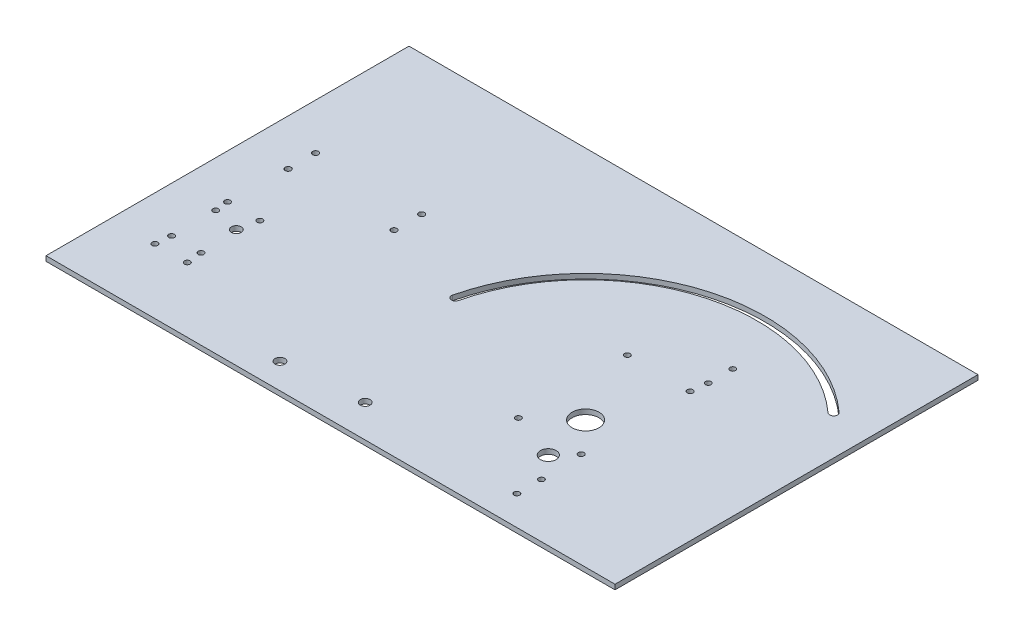
ISO-10303-21;
HEADER;
FILE_DESCRIPTION(('STEP AP214'),'2;1');
FILE_NAME('part.step','',(''),(''),'','','');
FILE_SCHEMA(('AUTOMOTIVE_DESIGN { 1 0 10303 214 1 1 1 1 }'));
ENDSEC;
DATA;
#1=APPLICATION_CONTEXT('core data for automotive mechanical design processes');
#2=APPLICATION_PROTOCOL_DEFINITION('international standard','automotive_design',2000,#1);
#3=PRODUCT_CONTEXT('',#1,'mechanical');
#4=PRODUCT('Part','Part','',(#3));
#5=PRODUCT_RELATED_PRODUCT_CATEGORY('part','',(#4));
#6=PRODUCT_DEFINITION_FORMATION('','',#4);
#7=PRODUCT_DEFINITION_CONTEXT('part definition',#1,'design');
#8=PRODUCT_DEFINITION('design','',#6,#7);
#9=PRODUCT_DEFINITION_SHAPE('','',#8);
#10=(LENGTH_UNIT() NAMED_UNIT(*) SI_UNIT(.MILLI.,.METRE.));
#11=(NAMED_UNIT(*) PLANE_ANGLE_UNIT() SI_UNIT($,.RADIAN.));
#12=(NAMED_UNIT(*) SI_UNIT($,.STERADIAN.) SOLID_ANGLE_UNIT());
#13=UNCERTAINTY_MEASURE_WITH_UNIT(LENGTH_MEASURE(1.E-05),#10,'distance_accuracy_value','');
#14=(GEOMETRIC_REPRESENTATION_CONTEXT(3) GLOBAL_UNCERTAINTY_ASSIGNED_CONTEXT((#13)) GLOBAL_UNIT_ASSIGNED_CONTEXT((#10,
#11,#12)) REPRESENTATION_CONTEXT('',''));
#15=CARTESIAN_POINT('',(0.,0.,0.));
#16=DIRECTION('',(0.,0.,1.));
#17=DIRECTION('',(1.,0.,0.));
#18=AXIS2_PLACEMENT_3D('',#15,#16,#17);
#19=CARTESIAN_POINT('',(0.,3.175,0.));
#20=DIRECTION('',(0.,1.,0.));
#21=DIRECTION('',(0.,0.,1.));
#22=AXIS2_PLACEMENT_3D('',#19,#20,#21);
#23=PLANE('',#22);
#24=CARTESIAN_POINT('',(107.95,3.175,6.35000000000002));
#25=DIRECTION('',(0.,-1.,0.));
#26=DIRECTION('',(0.,0.,1.));
#27=AXIS2_PLACEMENT_3D('',#24,#25,#26);
#28=CIRCLE('',#27,116.205);
#29=CARTESIAN_POINT('',(-5.09167129174462,3.175,-20.5792141840263));
#30=VERTEX_POINT('',#29);
#31=CARTESIAN_POINT('',(185.852793296089,3.175,-79.8750359331138));
#32=VERTEX_POINT('',#31);
#33=EDGE_CURVE('E110',#30,#32,#28,.T.);
#34=ORIENTED_EDGE('',*,*,#33,.T.);
#35=CARTESIAN_POINT('',(184.15,3.175,-77.9903356941386));
#36=DIRECTION('',(0.,-1.,0.));
#37=DIRECTION('',(0.,0.,-1.));
#38=AXIS2_PLACEMENT_3D('',#35,#36,#37);
#39=CIRCLE('',#38,2.53999999999999);
#40=CARTESIAN_POINT('',(182.447206703911,3.175,-76.1056354551635));
#41=VERTEX_POINT('',#40);
#42=EDGE_CURVE('E120',#32,#41,#39,.T.);
#43=ORIENTED_EDGE('',*,*,#42,.T.);
#44=CARTESIAN_POINT('',(107.95,3.175,6.35000000000002));
#45=DIRECTION('',(0.,1.,0.));
#46=DIRECTION('',(0.,0.,1.));
#47=AXIS2_PLACEMENT_3D('',#44,#45,#46);
#48=CIRCLE('',#47,111.125);
#49=CARTESIAN_POINT('',(-0.14995888554814,3.175,-19.4019807770743));
#50=VERTEX_POINT('',#49);
#51=EDGE_CURVE('E58',#41,#50,#48,.T.);
#52=ORIENTED_EDGE('',*,*,#51,.T.);
#53=CARTESIAN_POINT('',(-2.62081508864639,3.175,-19.9905974805503));
#54=DIRECTION('',(0.,-1.,0.));
#55=DIRECTION('',(0.,0.,-1.));
#56=AXIS2_PLACEMENT_3D('',#53,#54,#55);
#57=CIRCLE('',#56,2.53999999999999);
#58=EDGE_CURVE('E117',#50,#30,#57,.T.);
#59=ORIENTED_EDGE('',*,*,#58,.T.);
#60=EDGE_LOOP('',(#34,#43,#52,#59));
#61=FACE_BOUND('',#60,.T.);
#62=DIRECTION('',(1.,0.,0.));
#63=VECTOR('',#62,1.);
#64=CARTESIAN_POINT('',(-158.75,3.175,-146.05));
#65=LINE('',#64,#63);
#66=CARTESIAN_POINT('',(-158.75,3.175,-146.05));
#67=VERTEX_POINT('',#66);
#68=CARTESIAN_POINT('',(209.55,3.175,-146.05));
#69=VERTEX_POINT('',#68);
#70=EDGE_CURVE('E156',#67,#69,#65,.T.);
#71=ORIENTED_EDGE('',*,*,#70,.F.);
#72=DIRECTION('',(0.,0.,1.));
#73=VECTOR('',#72,1.);
#74=CARTESIAN_POINT('',(-158.75,3.175,-88.9));
#75=LINE('',#74,#73);
#76=CARTESIAN_POINT('',(-158.75,3.175,88.9));
#77=VERTEX_POINT('',#76);
#78=EDGE_CURVE('E375',#67,#77,#75,.T.);
#79=ORIENTED_EDGE('',*,*,#78,.T.);
#80=DIRECTION('',(1.,0.,0.));
#81=VECTOR('',#80,1.);
#82=CARTESIAN_POINT('',(-158.75,3.175,88.9));
#83=LINE('',#82,#81);
#84=CARTESIAN_POINT('',(209.55,3.175,88.9));
#85=VERTEX_POINT('',#84);
#86=EDGE_CURVE('E51',#77,#85,#83,.T.);
#87=ORIENTED_EDGE('',*,*,#86,.T.);
#88=DIRECTION('',(0.,0.,1.));
#89=VECTOR('',#88,1.);
#90=CARTESIAN_POINT('',(209.55,3.175,-146.05));
#91=LINE('',#90,#89);
#92=EDGE_CURVE('E160',#69,#85,#91,.T.);
#93=ORIENTED_EDGE('',*,*,#92,.F.);
#94=EDGE_LOOP('',(#71,#79,#87,#93));
#95=FACE_BOUND('',#94,.T.);
#96=CARTESIAN_POINT('',(-129.2225,3.175,37.1475));
#97=DIRECTION('',(0.,1.,0.));
#98=DIRECTION('',(0.,0.,1.));
#99=AXIS2_PLACEMENT_3D('',#96,#97,#98);
#100=CIRCLE('',#99,1.84149999999993);
#101=CARTESIAN_POINT('',(-129.2225,3.175,38.989));
#102=VERTEX_POINT('',#101);
#103=EDGE_CURVE('E215',#102,#102,#100,.T.);
#104=ORIENTED_EDGE('',*,*,#103,.F.);
#105=EDGE_LOOP('',(#104));
#106=FACE_BOUND('',#105,.T.);
#107=CARTESIAN_POINT('',(-130.175,3.175,46.99));
#108=DIRECTION('',(0.,1.,0.));
#109=DIRECTION('',(0.,0.,1.));
#110=AXIS2_PLACEMENT_3D('',#107,#108,#109);
#111=CIRCLE('',#110,1.84149999999999);
#112=CARTESIAN_POINT('',(-130.175,3.175,48.8315));
#113=VERTEX_POINT('',#112);
#114=EDGE_CURVE('E224',#113,#113,#111,.T.);
#115=ORIENTED_EDGE('',*,*,#114,.F.);
#116=EDGE_LOOP('',(#115));
#117=FACE_BOUND('',#116,.T.);
#118=CARTESIAN_POINT('',(-110.1725,3.175,37.1475));
#119=DIRECTION('',(0.,1.,0.));
#120=DIRECTION('',(0.,0.,1.));
#121=AXIS2_PLACEMENT_3D('',#118,#119,#120);
#122=CIRCLE('',#121,1.84149999999996);
#123=CARTESIAN_POINT('',(-110.1725,3.175,38.989));
#124=VERTEX_POINT('',#123);
#125=EDGE_CURVE('E199',#124,#124,#122,.T.);
#126=ORIENTED_EDGE('',*,*,#125,.F.);
#127=EDGE_LOOP('',(#126));
#128=FACE_BOUND('',#127,.T.);
#129=CARTESIAN_POINT('',(-129.2225,3.175,8.57250000000002));
#130=DIRECTION('',(0.,1.,0.));
#131=DIRECTION('',(0.,0.,1.));
#132=AXIS2_PLACEMENT_3D('',#129,#130,#131);
#133=CIRCLE('',#132,1.84150000000002);
#134=CARTESIAN_POINT('',(-129.2225,3.175,10.414));
#135=VERTEX_POINT('',#134);
#136=EDGE_CURVE('E208',#135,#135,#133,.T.);
#137=ORIENTED_EDGE('',*,*,#136,.F.);
#138=EDGE_LOOP('',(#137));
#139=FACE_BOUND('',#138,.T.);
#140=CARTESIAN_POINT('',(85.0900000000001,3.175,-43.4975));
#141=DIRECTION('',(0.,1.,0.));
#142=DIRECTION('',(0.,0.,1.));
#143=AXIS2_PLACEMENT_3D('',#140,#141,#142);
#144=CIRCLE('',#143,1.84150000000004);
#145=CARTESIAN_POINT('',(85.0900000000001,3.175,-41.6559999999999));
#146=VERTEX_POINT('',#145);
#147=EDGE_CURVE('E247',#146,#146,#144,.T.);
#148=ORIENTED_EDGE('',*,*,#147,.F.);
#149=EDGE_LOOP('',(#148));
#150=FACE_BOUND('',#149,.T.);
#151=CARTESIAN_POINT('',(85.0900000000001,3.175,26.9875));
#152=DIRECTION('',(0.,1.,0.));
#153=DIRECTION('',(0.,0.,1.));
#154=AXIS2_PLACEMENT_3D('',#151,#152,#153);
#155=CIRCLE('',#154,1.84149999999996);
#156=CARTESIAN_POINT('',(85.0900000000001,3.175,28.829));
#157=VERTEX_POINT('',#156);
#158=EDGE_CURVE('E256',#157,#157,#155,.T.);
#159=ORIENTED_EDGE('',*,*,#158,.F.);
#160=EDGE_LOOP('',(#159));
#161=FACE_BOUND('',#160,.T.);
#162=CARTESIAN_POINT('',(125.73,3.175,26.9875));
#163=DIRECTION('',(0.,1.,0.));
#164=DIRECTION('',(0.,0.,1.));
#165=AXIS2_PLACEMENT_3D('',#162,#163,#164);
#166=CIRCLE('',#165,1.84149999999999);
#167=CARTESIAN_POINT('',(125.73,3.175,28.829));
#168=VERTEX_POINT('',#167);
#169=EDGE_CURVE('E231',#168,#168,#166,.T.);
#170=ORIENTED_EDGE('',*,*,#169,.F.);
#171=EDGE_LOOP('',(#170));
#172=FACE_BOUND('',#171,.T.);
#173=CARTESIAN_POINT('',(-109.22,3.175,46.99));
#174=DIRECTION('',(0.,1.,0.));
#175=DIRECTION('',(0.,0.,1.));
#176=AXIS2_PLACEMENT_3D('',#173,#174,#175);
#177=CIRCLE('',#176,1.8415);
#178=CARTESIAN_POINT('',(-109.22,3.175,48.8315));
#179=VERTEX_POINT('',#178);
#180=EDGE_CURVE('E240',#179,#179,#177,.T.);
#181=ORIENTED_EDGE('',*,*,#180,.F.);
#182=EDGE_LOOP('',(#181));
#183=FACE_BOUND('',#182,.T.);
#184=CARTESIAN_POINT('',(-130.175,3.175,0.));
#185=DIRECTION('',(0.,1.,0.));
#186=DIRECTION('',(0.,0.,1.));
#187=AXIS2_PLACEMENT_3D('',#184,#185,#186);
#188=CIRCLE('',#187,1.84149999999999);
#189=CARTESIAN_POINT('',(-130.175,3.175,1.8415));
#190=VERTEX_POINT('',#189);
#191=EDGE_CURVE('E183',#190,#190,#188,.T.);
#192=ORIENTED_EDGE('',*,*,#191,.F.);
#193=EDGE_LOOP('',(#192));
#194=FACE_BOUND('',#193,.T.);
#195=CARTESIAN_POINT('',(-109.22,3.175,0.));
#196=DIRECTION('',(0.,1.,0.));
#197=DIRECTION('',(0.,0.,1.));
#198=AXIS2_PLACEMENT_3D('',#195,#196,#197);
#199=CIRCLE('',#198,1.8415);
#200=CARTESIAN_POINT('',(-109.22,3.175,1.84150000000001));
#201=VERTEX_POINT('',#200);
#202=EDGE_CURVE('E192',#201,#201,#199,.T.);
#203=ORIENTED_EDGE('',*,*,#202,.F.);
#204=EDGE_LOOP('',(#203));
#205=FACE_BOUND('',#204,.T.);
#206=CARTESIAN_POINT('',(125.73,3.175,-43.4975));
#207=DIRECTION('',(0.,1.,0.));
#208=DIRECTION('',(0.,0.,1.));
#209=AXIS2_PLACEMENT_3D('',#206,#207,#208);
#210=CIRCLE('',#209,1.84150000000002);
#211=CARTESIAN_POINT('',(125.73,3.175,-41.6559999999999));
#212=VERTEX_POINT('',#211);
#213=EDGE_CURVE('E251',#212,#212,#210,.T.);
#214=ORIENTED_EDGE('',*,*,#213,.F.);
#215=EDGE_LOOP('',(#214));
#216=FACE_BOUND('',#215,.T.);
#217=CARTESIAN_POINT('',(127.,3.175,69.85));
#218=DIRECTION('',(0.,-1.,0.));
#219=DIRECTION('',(0.,0.,-1.));
#220=AXIS2_PLACEMENT_3D('',#217,#218,#219);
#221=CIRCLE('',#220,1.80340000000001);
#222=CARTESIAN_POINT('',(127.,3.175,68.0466));
#223=VERTEX_POINT('',#222);
#224=EDGE_CURVE('E271',#223,#223,#221,.T.);
#225=ORIENTED_EDGE('',*,*,#224,.T.);
#226=EDGE_LOOP('',(#225));
#227=FACE_BOUND('',#226,.T.);
#228=CARTESIAN_POINT('',(127.,3.175,53.975));
#229=DIRECTION('',(0.,-1.,0.));
#230=DIRECTION('',(0.,0.,-1.));
#231=AXIS2_PLACEMENT_3D('',#228,#229,#230);
#232=CIRCLE('',#231,1.80340000000001);
#233=CARTESIAN_POINT('',(127.,3.175,52.1716));
#234=VERTEX_POINT('',#233);
#235=EDGE_CURVE('E284',#234,#234,#232,.T.);
#236=ORIENTED_EDGE('',*,*,#235,.T.);
#237=EDGE_LOOP('',(#236));
#238=FACE_BOUND('',#237,.T.);
#239=CARTESIAN_POINT('',(127.,3.175,-53.975));
#240=DIRECTION('',(0.,-1.,0.));
#241=DIRECTION('',(0.,0.,-1.));
#242=AXIS2_PLACEMENT_3D('',#239,#240,#241);
#243=CIRCLE('',#242,1.80340000000001);
#244=CARTESIAN_POINT('',(127.,3.175,-55.7784));
#245=VERTEX_POINT('',#244);
#246=EDGE_CURVE('E292',#245,#245,#243,.T.);
#247=ORIENTED_EDGE('',*,*,#246,.T.);
#248=EDGE_LOOP('',(#247));
#249=FACE_BOUND('',#248,.T.);
#250=CARTESIAN_POINT('',(127.,3.175,-69.85));
#251=DIRECTION('',(0.,-1.,0.));
#252=DIRECTION('',(0.,0.,-1.));
#253=AXIS2_PLACEMENT_3D('',#250,#251,#252);
#254=CIRCLE('',#253,1.80340000000001);
#255=CARTESIAN_POINT('',(127.,3.175,-71.6534));
#256=VERTEX_POINT('',#255);
#257=EDGE_CURVE('E267',#256,#256,#254,.T.);
#258=ORIENTED_EDGE('',*,*,#257,.T.);
#259=EDGE_LOOP('',(#258));
#260=FACE_BOUND('',#259,.T.);
#261=CARTESIAN_POINT('',(115.57,3.175,38.1));
#262=DIRECTION('',(0.,1.,0.));
#263=DIRECTION('',(0.,0.,1.));
#264=AXIS2_PLACEMENT_3D('',#261,#262,#263);
#265=CIRCLE('',#264,5.08000000000001);
#266=CARTESIAN_POINT('',(115.57,3.175,43.18));
#267=VERTEX_POINT('',#266);
#268=EDGE_CURVE('E275',#267,#267,#265,.T.);
#269=ORIENTED_EDGE('',*,*,#268,.F.);
#270=EDGE_LOOP('',(#269));
#271=FACE_BOUND('',#270,.T.);
#272=CARTESIAN_POINT('',(-23.829539608584,3.175,72.39));
#273=DIRECTION('',(0.,-1.,0.));
#274=DIRECTION('',(0.,0.,-1.));
#275=AXIS2_PLACEMENT_3D('',#272,#273,#274);
#276=CIRCLE('',#275,3.175);
#277=CARTESIAN_POINT('',(-23.829539608584,3.175,69.215));
#278=VERTEX_POINT('',#277);
#279=EDGE_CURVE('E311',#278,#278,#276,.T.);
#280=ORIENTED_EDGE('',*,*,#279,.T.);
#281=EDGE_LOOP('',(#280));
#282=FACE_BOUND('',#281,.T.);
#283=CARTESIAN_POINT('',(26.764302072,3.175,67.818));
#284=DIRECTION('',(0.,-1.,0.));
#285=DIRECTION('',(0.,0.,-1.));
#286=AXIS2_PLACEMENT_3D('',#283,#284,#285);
#287=CIRCLE('',#286,3.175);
#288=CARTESIAN_POINT('',(26.764302072,3.175,64.643));
#289=VERTEX_POINT('',#288);
#290=EDGE_CURVE('E320',#289,#289,#287,.T.);
#291=ORIENTED_EDGE('',*,*,#290,.T.);
#292=EDGE_LOOP('',(#291));
#293=FACE_BOUND('',#292,.T.);
#294=CARTESIAN_POINT('',(-129.032,3.175,-38.1));
#295=DIRECTION('',(0.,1.,0.));
#296=DIRECTION('',(0.,0.,1.));
#297=AXIS2_PLACEMENT_3D('',#294,#295,#296);
#298=CIRCLE('',#297,1.90499999999999);
#299=CARTESIAN_POINT('',(-129.032,3.175,-36.195));
#300=VERTEX_POINT('',#299);
#301=EDGE_CURVE('E335',#300,#300,#298,.T.);
#302=ORIENTED_EDGE('',*,*,#301,.F.);
#303=EDGE_LOOP('',(#302));
#304=FACE_BOUND('',#303,.T.);
#305=CARTESIAN_POINT('',(-129.032,3.175,-55.88));
#306=DIRECTION('',(0.,1.,0.));
#307=DIRECTION('',(0.,0.,1.));
#308=AXIS2_PLACEMENT_3D('',#305,#306,#307);
#309=CIRCLE('',#308,1.90499999999999);
#310=CARTESIAN_POINT('',(-129.032,3.175,-53.975));
#311=VERTEX_POINT('',#310);
#312=EDGE_CURVE('E351',#311,#311,#309,.T.);
#313=ORIENTED_EDGE('',*,*,#312,.F.);
#314=EDGE_LOOP('',(#313));
#315=FACE_BOUND('',#314,.T.);
#316=CARTESIAN_POINT('',(-111.76,3.175,12.7));
#317=DIRECTION('',(0.,1.,0.));
#318=DIRECTION('',(0.,0.,1.));
#319=AXIS2_PLACEMENT_3D('',#316,#317,#318);
#320=CIRCLE('',#319,3.175);
#321=CARTESIAN_POINT('',(-111.76,3.175,15.875));
#322=VERTEX_POINT('',#321);
#323=EDGE_CURVE('E367',#322,#322,#320,.T.);
#324=ORIENTED_EDGE('',*,*,#323,.F.);
#325=EDGE_LOOP('',(#324));
#326=FACE_BOUND('',#325,.T.);
#327=CARTESIAN_POINT('',(107.95,3.175,6.35000000000002));
#328=DIRECTION('',(0.,1.,0.));
#329=DIRECTION('',(0.,0.,1.));
#330=AXIS2_PLACEMENT_3D('',#327,#328,#329);
#331=CIRCLE('',#330,8.73125);
#332=CARTESIAN_POINT('',(107.95,3.175,15.08125));
#333=VERTEX_POINT('',#332);
#334=EDGE_CURVE('E359',#333,#333,#331,.T.);
#335=ORIENTED_EDGE('',*,*,#334,.F.);
#336=EDGE_LOOP('',(#335));
#337=FACE_BOUND('',#336,.T.);
#338=CARTESIAN_POINT('',(-60.452,3.175,-55.88));
#339=DIRECTION('',(0.,1.,0.));
#340=DIRECTION('',(0.,0.,1.));
#341=AXIS2_PLACEMENT_3D('',#338,#339,#340);
#342=CIRCLE('',#341,1.90500000000001);
#343=CARTESIAN_POINT('',(-60.452,3.175,-53.975));
#344=VERTEX_POINT('',#343);
#345=EDGE_CURVE('E343',#344,#344,#342,.T.);
#346=ORIENTED_EDGE('',*,*,#345,.F.);
#347=EDGE_LOOP('',(#346));
#348=FACE_BOUND('',#347,.T.);
#349=CARTESIAN_POINT('',(-60.452,3.175,-38.1));
#350=DIRECTION('',(0.,1.,0.));
#351=DIRECTION('',(0.,0.,1.));
#352=AXIS2_PLACEMENT_3D('',#349,#350,#351);
#353=CIRCLE('',#352,1.90500000000001);
#354=CARTESIAN_POINT('',(-60.452,3.175,-36.195));
#355=VERTEX_POINT('',#354);
#356=EDGE_CURVE('E327',#355,#355,#353,.T.);
#357=ORIENTED_EDGE('',*,*,#356,.F.);
#358=EDGE_LOOP('',(#357));
#359=FACE_BOUND('',#358,.T.);
#360=ADVANCED_FACE('F42',(#61,#95,#106,#117,#128,#139,#150,#161,#172,#183,#194,#205,#216,#227,
#238,#249,#260,#271,#282,#293,#304,#315,#326,#337,#348,#359),#23,.T.);
#361=CARTESIAN_POINT('',(0.,0.,0.));
#362=DIRECTION('',(0.,1.,0.));
#363=DIRECTION('',(0.,0.,1.));
#364=AXIS2_PLACEMENT_3D('',#361,#362,#363);
#365=PLANE('',#364);
#366=CARTESIAN_POINT('',(184.15,0.,-77.9903356941386));
#367=DIRECTION('',(0.,-1.,0.));
#368=DIRECTION('',(0.,0.,-1.));
#369=AXIS2_PLACEMENT_3D('',#366,#367,#368);
#370=CIRCLE('',#369,2.53999999999999);
#371=CARTESIAN_POINT('',(185.852793296089,0.,-79.8750359331138));
#372=VERTEX_POINT('',#371);
#373=CARTESIAN_POINT('',(182.447206703911,0.,-76.1056354551635));
#374=VERTEX_POINT('',#373);
#375=EDGE_CURVE('E141',#372,#374,#370,.T.);
#376=ORIENTED_EDGE('',*,*,#375,.F.);
#377=CARTESIAN_POINT('',(107.95,0.,6.35000000000002));
#378=DIRECTION('',(0.,-1.,0.));
#379=DIRECTION('',(0.,0.,1.));
#380=AXIS2_PLACEMENT_3D('',#377,#378,#379);
#381=CIRCLE('',#380,116.205);
#382=CARTESIAN_POINT('',(-5.09167129174462,0.,-20.5792141840263));
#383=VERTEX_POINT('',#382);
#384=EDGE_CURVE('E66',#383,#372,#381,.T.);
#385=ORIENTED_EDGE('',*,*,#384,.F.);
#386=CARTESIAN_POINT('',(-2.62081508864639,0.,-19.9905974805503));
#387=DIRECTION('',(0.,-1.,0.));
#388=DIRECTION('',(0.,0.,-1.));
#389=AXIS2_PLACEMENT_3D('',#386,#387,#388);
#390=CIRCLE('',#389,2.53999999999999);
#391=CARTESIAN_POINT('',(-0.14995888554814,0.,-19.4019807770743));
#392=VERTEX_POINT('',#391);
#393=EDGE_CURVE('E128',#392,#383,#390,.T.);
#394=ORIENTED_EDGE('',*,*,#393,.F.);
#395=CARTESIAN_POINT('',(107.95,0.,6.35000000000002));
#396=DIRECTION('',(0.,1.,0.));
#397=DIRECTION('',(0.,0.,1.));
#398=AXIS2_PLACEMENT_3D('',#395,#396,#397);
#399=CIRCLE('',#398,111.125);
#400=EDGE_CURVE('E132',#374,#392,#399,.T.);
#401=ORIENTED_EDGE('',*,*,#400,.F.);
#402=EDGE_LOOP('',(#376,#385,#394,#401));
#403=FACE_BOUND('',#402,.T.);
#404=DIRECTION('',(0.,0.,1.));
#405=VECTOR('',#404,1.);
#406=CARTESIAN_POINT('',(-158.75,0.,-88.9));
#407=LINE('',#406,#405);
#408=CARTESIAN_POINT('',(-158.75,0.,-146.05));
#409=VERTEX_POINT('',#408);
#410=CARTESIAN_POINT('',(-158.75,0.,88.9));
#411=VERTEX_POINT('',#410);
#412=EDGE_CURVE('E371',#409,#411,#407,.T.);
#413=ORIENTED_EDGE('',*,*,#412,.F.);
#414=DIRECTION('',(1.,0.,0.));
#415=VECTOR('',#414,1.);
#416=CARTESIAN_POINT('',(-158.75,0.,-146.05));
#417=LINE('',#416,#415);
#418=CARTESIAN_POINT('',(209.55,0.,-146.05));
#419=VERTEX_POINT('',#418);
#420=EDGE_CURVE('E150',#409,#419,#417,.T.);
#421=ORIENTED_EDGE('',*,*,#420,.T.);
#422=DIRECTION('',(0.,0.,1.));
#423=VECTOR('',#422,1.);
#424=CARTESIAN_POINT('',(209.55,0.,-146.05));
#425=LINE('',#424,#423);
#426=CARTESIAN_POINT('',(209.55,0.,88.9));
#427=VERTEX_POINT('',#426);
#428=EDGE_CURVE('E161',#419,#427,#425,.T.);
#429=ORIENTED_EDGE('',*,*,#428,.T.);
#430=DIRECTION('',(1.,0.,0.));
#431=VECTOR('',#430,1.);
#432=CARTESIAN_POINT('',(-158.75,0.,88.9));
#433=LINE('',#432,#431);
#434=EDGE_CURVE('E378',#411,#427,#433,.T.);
#435=ORIENTED_EDGE('',*,*,#434,.F.);
#436=EDGE_LOOP('',(#413,#421,#429,#435));
#437=FACE_BOUND('',#436,.T.);
#438=CARTESIAN_POINT('',(-129.2225,0.,37.1475));
#439=DIRECTION('',(0.,1.,0.));
#440=DIRECTION('',(0.,0.,1.));
#441=AXIS2_PLACEMENT_3D('',#438,#439,#440);
#442=CIRCLE('',#441,1.84149999999993);
#443=CARTESIAN_POINT('',(-129.2225,0.,38.989));
#444=VERTEX_POINT('',#443);
#445=EDGE_CURVE('E220',#444,#444,#442,.T.);
#446=ORIENTED_EDGE('',*,*,#445,.T.);
#447=EDGE_LOOP('',(#446));
#448=FACE_BOUND('',#447,.T.);
#449=CARTESIAN_POINT('',(-130.175,0.,46.99));
#450=DIRECTION('',(0.,1.,0.));
#451=DIRECTION('',(0.,0.,1.));
#452=AXIS2_PLACEMENT_3D('',#449,#450,#451);
#453=CIRCLE('',#452,1.84149999999999);
#454=CARTESIAN_POINT('',(-130.175,0.,48.8315));
#455=VERTEX_POINT('',#454);
#456=EDGE_CURVE('E203',#455,#455,#453,.T.);
#457=ORIENTED_EDGE('',*,*,#456,.T.);
#458=EDGE_LOOP('',(#457));
#459=FACE_BOUND('',#458,.T.);
#460=CARTESIAN_POINT('',(-110.1725,0.,37.1475));
#461=DIRECTION('',(0.,1.,0.));
#462=DIRECTION('',(0.,0.,1.));
#463=AXIS2_PLACEMENT_3D('',#460,#461,#462);
#464=CIRCLE('',#463,1.84149999999996);
#465=CARTESIAN_POINT('',(-110.1725,0.,38.989));
#466=VERTEX_POINT('',#465);
#467=EDGE_CURVE('E204',#466,#466,#464,.T.);
#468=ORIENTED_EDGE('',*,*,#467,.T.);
#469=EDGE_LOOP('',(#468));
#470=FACE_BOUND('',#469,.T.);
#471=CARTESIAN_POINT('',(-129.2225,0.,8.57250000000002));
#472=DIRECTION('',(0.,1.,0.));
#473=DIRECTION('',(0.,0.,1.));
#474=AXIS2_PLACEMENT_3D('',#471,#472,#473);
#475=CIRCLE('',#474,1.84150000000002);
#476=CARTESIAN_POINT('',(-129.2225,0.,10.414));
#477=VERTEX_POINT('',#476);
#478=EDGE_CURVE('E187',#477,#477,#475,.T.);
#479=ORIENTED_EDGE('',*,*,#478,.T.);
#480=EDGE_LOOP('',(#479));
#481=FACE_BOUND('',#480,.T.);
#482=CARTESIAN_POINT('',(85.0900000000001,0.,-43.4975));
#483=DIRECTION('',(0.,1.,0.));
#484=DIRECTION('',(0.,0.,1.));
#485=AXIS2_PLACEMENT_3D('',#482,#483,#484);
#486=CIRCLE('',#485,1.84150000000004);
#487=CARTESIAN_POINT('',(85.0900000000001,0.,-41.6559999999999));
#488=VERTEX_POINT('',#487);
#489=EDGE_CURVE('E252',#488,#488,#486,.T.);
#490=ORIENTED_EDGE('',*,*,#489,.T.);
#491=EDGE_LOOP('',(#490));
#492=FACE_BOUND('',#491,.T.);
#493=CARTESIAN_POINT('',(85.0900000000001,0.,26.9875));
#494=DIRECTION('',(0.,1.,0.));
#495=DIRECTION('',(0.,0.,1.));
#496=AXIS2_PLACEMENT_3D('',#493,#494,#495);
#497=CIRCLE('',#496,1.84149999999996);
#498=CARTESIAN_POINT('',(85.0900000000001,0.,28.829));
#499=VERTEX_POINT('',#498);
#500=EDGE_CURVE('E235',#499,#499,#497,.T.);
#501=ORIENTED_EDGE('',*,*,#500,.T.);
#502=EDGE_LOOP('',(#501));
#503=FACE_BOUND('',#502,.T.);
#504=CARTESIAN_POINT('',(125.73,0.,26.9875));
#505=DIRECTION('',(0.,1.,0.));
#506=DIRECTION('',(0.,0.,1.));
#507=AXIS2_PLACEMENT_3D('',#504,#505,#506);
#508=CIRCLE('',#507,1.84149999999999);
#509=CARTESIAN_POINT('',(125.73,0.,28.829));
#510=VERTEX_POINT('',#509);
#511=EDGE_CURVE('E236',#510,#510,#508,.T.);
#512=ORIENTED_EDGE('',*,*,#511,.T.);
#513=EDGE_LOOP('',(#512));
#514=FACE_BOUND('',#513,.T.);
#515=CARTESIAN_POINT('',(-109.22,0.,46.99));
#516=DIRECTION('',(0.,1.,0.));
#517=DIRECTION('',(0.,0.,1.));
#518=AXIS2_PLACEMENT_3D('',#515,#516,#517);
#519=CIRCLE('',#518,1.8415);
#520=CARTESIAN_POINT('',(-109.22,0.,48.8315));
#521=VERTEX_POINT('',#520);
#522=EDGE_CURVE('E219',#521,#521,#519,.T.);
#523=ORIENTED_EDGE('',*,*,#522,.T.);
#524=EDGE_LOOP('',(#523));
#525=FACE_BOUND('',#524,.T.);
#526=CARTESIAN_POINT('',(-130.175,0.,0.));
#527=DIRECTION('',(0.,1.,0.));
#528=DIRECTION('',(0.,0.,1.));
#529=AXIS2_PLACEMENT_3D('',#526,#527,#528);
#530=CIRCLE('',#529,1.84149999999999);
#531=CARTESIAN_POINT('',(-130.175,0.,1.8415));
#532=VERTEX_POINT('',#531);
#533=EDGE_CURVE('E188',#532,#532,#530,.T.);
#534=ORIENTED_EDGE('',*,*,#533,.T.);
#535=EDGE_LOOP('',(#534));
#536=FACE_BOUND('',#535,.T.);
#537=CARTESIAN_POINT('',(-109.22,0.,0.));
#538=DIRECTION('',(0.,1.,0.));
#539=DIRECTION('',(0.,0.,1.));
#540=AXIS2_PLACEMENT_3D('',#537,#538,#539);
#541=CIRCLE('',#540,1.8415);
#542=CARTESIAN_POINT('',(-109.22,0.,1.84150000000001));
#543=VERTEX_POINT('',#542);
#544=EDGE_CURVE('E176',#543,#543,#541,.T.);
#545=ORIENTED_EDGE('',*,*,#544,.T.);
#546=EDGE_LOOP('',(#545));
#547=FACE_BOUND('',#546,.T.);
#548=CARTESIAN_POINT('',(125.73,0.,-43.4975));
#549=DIRECTION('',(0.,1.,0.));
#550=DIRECTION('',(0.,0.,1.));
#551=AXIS2_PLACEMENT_3D('',#548,#549,#550);
#552=CIRCLE('',#551,1.84150000000002);
#553=CARTESIAN_POINT('',(125.73,0.,-41.6559999999999));
#554=VERTEX_POINT('',#553);
#555=EDGE_CURVE('E263',#554,#554,#552,.T.);
#556=ORIENTED_EDGE('',*,*,#555,.T.);
#557=EDGE_LOOP('',(#556));
#558=FACE_BOUND('',#557,.T.);
#559=CARTESIAN_POINT('',(127.,0.,69.85));
#560=DIRECTION('',(0.,-1.,0.));
#561=DIRECTION('',(0.,0.,-1.));
#562=AXIS2_PLACEMENT_3D('',#559,#560,#561);
#563=CIRCLE('',#562,1.80340000000001);
#564=CARTESIAN_POINT('',(127.,0.,68.0466));
#565=VERTEX_POINT('',#564);
#566=EDGE_CURVE('E276',#565,#565,#563,.T.);
#567=ORIENTED_EDGE('',*,*,#566,.F.);
#568=EDGE_LOOP('',(#567));
#569=FACE_BOUND('',#568,.T.);
#570=CARTESIAN_POINT('',(127.,0.,53.975));
#571=DIRECTION('',(0.,-1.,0.));
#572=DIRECTION('',(0.,0.,-1.));
#573=AXIS2_PLACEMENT_3D('',#570,#571,#572);
#574=CIRCLE('',#573,1.80340000000001);
#575=CARTESIAN_POINT('',(127.,0.,52.1716));
#576=VERTEX_POINT('',#575);
#577=EDGE_CURVE('E280',#576,#576,#574,.T.);
#578=ORIENTED_EDGE('',*,*,#577,.F.);
#579=EDGE_LOOP('',(#578));
#580=FACE_BOUND('',#579,.T.);
#581=CARTESIAN_POINT('',(127.,0.,-53.975));
#582=DIRECTION('',(0.,-1.,0.));
#583=DIRECTION('',(0.,0.,-1.));
#584=AXIS2_PLACEMENT_3D('',#581,#582,#583);
#585=CIRCLE('',#584,1.80340000000001);
#586=CARTESIAN_POINT('',(127.,0.,-55.7784));
#587=VERTEX_POINT('',#586);
#588=EDGE_CURVE('E288',#587,#587,#585,.T.);
#589=ORIENTED_EDGE('',*,*,#588,.F.);
#590=EDGE_LOOP('',(#589));
#591=FACE_BOUND('',#590,.T.);
#592=CARTESIAN_POINT('',(127.,0.,-69.85));
#593=DIRECTION('',(0.,-1.,0.));
#594=DIRECTION('',(0.,0.,-1.));
#595=AXIS2_PLACEMENT_3D('',#592,#593,#594);
#596=CIRCLE('',#595,1.80340000000001);
#597=CARTESIAN_POINT('',(127.,0.,-71.6534));
#598=VERTEX_POINT('',#597);
#599=EDGE_CURVE('E296',#598,#598,#596,.T.);
#600=ORIENTED_EDGE('',*,*,#599,.F.);
#601=EDGE_LOOP('',(#600));
#602=FACE_BOUND('',#601,.T.);
#603=CARTESIAN_POINT('',(115.57,0.,38.1));
#604=DIRECTION('',(0.,1.,0.));
#605=DIRECTION('',(0.,0.,1.));
#606=AXIS2_PLACEMENT_3D('',#603,#604,#605);
#607=CIRCLE('',#606,5.08000000000001);
#608=CARTESIAN_POINT('',(115.57,0.,43.18));
#609=VERTEX_POINT('',#608);
#610=EDGE_CURVE('E303',#609,#609,#607,.T.);
#611=ORIENTED_EDGE('',*,*,#610,.T.);
#612=EDGE_LOOP('',(#611));
#613=FACE_BOUND('',#612,.T.);
#614=CARTESIAN_POINT('',(-23.829539608584,0.,72.39));
#615=DIRECTION('',(0.,-1.,0.));
#616=DIRECTION('',(0.,0.,-1.));
#617=AXIS2_PLACEMENT_3D('',#614,#615,#616);
#618=CIRCLE('',#617,3.175);
#619=CARTESIAN_POINT('',(-23.829539608584,0.,69.215));
#620=VERTEX_POINT('',#619);
#621=EDGE_CURVE('E316',#620,#620,#618,.T.);
#622=ORIENTED_EDGE('',*,*,#621,.F.);
#623=EDGE_LOOP('',(#622));
#624=FACE_BOUND('',#623,.T.);
#625=CARTESIAN_POINT('',(26.764302072,0.,67.818));
#626=DIRECTION('',(0.,-1.,0.));
#627=DIRECTION('',(0.,0.,-1.));
#628=AXIS2_PLACEMENT_3D('',#625,#626,#627);
#629=CIRCLE('',#628,3.175);
#630=CARTESIAN_POINT('',(26.764302072,0.,64.643));
#631=VERTEX_POINT('',#630);
#632=EDGE_CURVE('E307',#631,#631,#629,.T.);
#633=ORIENTED_EDGE('',*,*,#632,.F.);
#634=EDGE_LOOP('',(#633));
#635=FACE_BOUND('',#634,.T.);
#636=CARTESIAN_POINT('',(-111.76,0.,12.7));
#637=DIRECTION('',(0.,1.,0.));
#638=DIRECTION('',(0.,0.,1.));
#639=AXIS2_PLACEMENT_3D('',#636,#637,#638);
#640=CIRCLE('',#639,3.175);
#641=CARTESIAN_POINT('',(-111.76,0.,15.875));
#642=VERTEX_POINT('',#641);
#643=EDGE_CURVE('E363',#642,#642,#640,.T.);
#644=ORIENTED_EDGE('',*,*,#643,.T.);
#645=EDGE_LOOP('',(#644));
#646=FACE_BOUND('',#645,.T.);
#647=CARTESIAN_POINT('',(107.95,0.,6.35000000000002));
#648=DIRECTION('',(0.,1.,0.));
#649=DIRECTION('',(0.,0.,1.));
#650=AXIS2_PLACEMENT_3D('',#647,#648,#649);
#651=CIRCLE('',#650,8.73125);
#652=CARTESIAN_POINT('',(107.95,0.,15.08125));
#653=VERTEX_POINT('',#652);
#654=EDGE_CURVE('E355',#653,#653,#651,.T.);
#655=ORIENTED_EDGE('',*,*,#654,.T.);
#656=EDGE_LOOP('',(#655));
#657=FACE_BOUND('',#656,.T.);
#658=CARTESIAN_POINT('',(-129.032,0.,-55.88));
#659=DIRECTION('',(0.,1.,0.));
#660=DIRECTION('',(0.,0.,1.));
#661=AXIS2_PLACEMENT_3D('',#658,#659,#660);
#662=CIRCLE('',#661,1.90499999999999);
#663=CARTESIAN_POINT('',(-129.032,0.,-53.975));
#664=VERTEX_POINT('',#663);
#665=EDGE_CURVE('E347',#664,#664,#662,.T.);
#666=ORIENTED_EDGE('',*,*,#665,.T.);
#667=EDGE_LOOP('',(#666));
#668=FACE_BOUND('',#667,.T.);
#669=CARTESIAN_POINT('',(-60.452,0.,-55.88));
#670=DIRECTION('',(0.,1.,0.));
#671=DIRECTION('',(0.,0.,1.));
#672=AXIS2_PLACEMENT_3D('',#669,#670,#671);
#673=CIRCLE('',#672,1.90500000000001);
#674=CARTESIAN_POINT('',(-60.452,0.,-53.975));
#675=VERTEX_POINT('',#674);
#676=EDGE_CURVE('E339',#675,#675,#673,.T.);
#677=ORIENTED_EDGE('',*,*,#676,.T.);
#678=EDGE_LOOP('',(#677));
#679=FACE_BOUND('',#678,.T.);
#680=CARTESIAN_POINT('',(-129.032,0.,-38.1));
#681=DIRECTION('',(0.,1.,0.));
#682=DIRECTION('',(0.,0.,1.));
#683=AXIS2_PLACEMENT_3D('',#680,#681,#682);
#684=CIRCLE('',#683,1.90499999999999);
#685=CARTESIAN_POINT('',(-129.032,0.,-36.195));
#686=VERTEX_POINT('',#685);
#687=EDGE_CURVE('E331',#686,#686,#684,.T.);
#688=ORIENTED_EDGE('',*,*,#687,.T.);
#689=EDGE_LOOP('',(#688));
#690=FACE_BOUND('',#689,.T.);
#691=CARTESIAN_POINT('',(-60.452,0.,-38.1));
#692=DIRECTION('',(0.,1.,0.));
#693=DIRECTION('',(0.,0.,1.));
#694=AXIS2_PLACEMENT_3D('',#691,#692,#693);
#695=CIRCLE('',#694,1.90500000000001);
#696=CARTESIAN_POINT('',(-60.452,0.,-36.195));
#697=VERTEX_POINT('',#696);
#698=EDGE_CURVE('E315',#697,#697,#695,.T.);
#699=ORIENTED_EDGE('',*,*,#698,.T.);
#700=EDGE_LOOP('',(#699));
#701=FACE_BOUND('',#700,.T.);
#702=ADVANCED_FACE('F394',(#403,#437,#448,#459,#470,#481,#492,#503,#514,#525,#536,#547,#558,
#569,#580,#591,#602,#613,#624,#635,#646,#657,#668,#679,#690,#701),#365,.F.);
#703=CARTESIAN_POINT('',(-158.75,3.175,-88.9));
#704=DIRECTION('',(1.,0.,0.));
#705=DIRECTION('',(0.,0.,-1.));
#706=AXIS2_PLACEMENT_3D('',#703,#704,#705);
#707=PLANE('',#706);
#708=ORIENTED_EDGE('',*,*,#412,.T.);
#709=DIRECTION('',(0.,-1.,0.));
#710=VECTOR('',#709,1.);
#711=CARTESIAN_POINT('',(-158.75,3.175,88.9));
#712=LINE('',#711,#710);
#713=EDGE_CURVE('E11',#77,#411,#712,.T.);
#714=ORIENTED_EDGE('',*,*,#713,.F.);
#715=ORIENTED_EDGE('',*,*,#78,.F.);
#716=DIRECTION('',(0.,-1.,0.));
#717=VECTOR('',#716,1.);
#718=CARTESIAN_POINT('',(-158.75,3.175,-146.05));
#719=LINE('',#718,#717);
#720=EDGE_CURVE('E165',#67,#409,#719,.T.);
#721=ORIENTED_EDGE('',*,*,#720,.T.);
#722=EDGE_LOOP('',(#708,#714,#715,#721));
#723=FACE_BOUND('',#722,.T.);
#724=ADVANCED_FACE('F44',(#723),#707,.F.);
#725=CARTESIAN_POINT('',(-158.75,3.175,88.9));
#726=DIRECTION('',(0.,0.,-1.));
#727=DIRECTION('',(-1.,0.,0.));
#728=AXIS2_PLACEMENT_3D('',#725,#726,#727);
#729=PLANE('',#728);
#730=ORIENTED_EDGE('',*,*,#434,.T.);
#731=DIRECTION('',(0.,-1.,0.));
#732=VECTOR('',#731,1.);
#733=CARTESIAN_POINT('',(209.55,3.175,88.9));
#734=LINE('',#733,#732);
#735=EDGE_CURVE('E172',#85,#427,#734,.T.);
#736=ORIENTED_EDGE('',*,*,#735,.F.);
#737=ORIENTED_EDGE('',*,*,#86,.F.);
#738=ORIENTED_EDGE('',*,*,#713,.T.);
#739=EDGE_LOOP('',(#730,#736,#737,#738));
#740=FACE_BOUND('',#739,.T.);
#741=ADVANCED_FACE('F386',(#740),#729,.F.);
#742=CARTESIAN_POINT('',(-111.76,3.175,12.7));
#743=DIRECTION('',(0.,-1.,0.));
#744=DIRECTION('',(0.,0.,-1.));
#745=AXIS2_PLACEMENT_3D('',#742,#743,#744);
#746=CYLINDRICAL_SURFACE('',#745,3.175);
#747=ORIENTED_EDGE('',*,*,#323,.T.);
#748=EDGE_LOOP('',(#747));
#749=FACE_BOUND('',#748,.T.);
#750=ORIENTED_EDGE('',*,*,#643,.F.);
#751=EDGE_LOOP('',(#750));
#752=FACE_BOUND('',#751,.T.);
#753=ADVANCED_FACE('F408',(#749,#752),#746,.F.);
#754=CARTESIAN_POINT('',(107.95,3.175,6.35000000000002));
#755=DIRECTION('',(0.,-1.,0.));
#756=DIRECTION('',(0.,0.,-1.));
#757=AXIS2_PLACEMENT_3D('',#754,#755,#756);
#758=CYLINDRICAL_SURFACE('',#757,8.73125);
#759=ORIENTED_EDGE('',*,*,#334,.T.);
#760=EDGE_LOOP('',(#759));
#761=FACE_BOUND('',#760,.T.);
#762=ORIENTED_EDGE('',*,*,#654,.F.);
#763=EDGE_LOOP('',(#762));
#764=FACE_BOUND('',#763,.T.);
#765=ADVANCED_FACE('F420',(#761,#764),#758,.F.);
#766=CARTESIAN_POINT('',(-129.032,3.175,-55.88));
#767=DIRECTION('',(0.,-1.,0.));
#768=DIRECTION('',(0.,0.,-1.));
#769=AXIS2_PLACEMENT_3D('',#766,#767,#768);
#770=CYLINDRICAL_SURFACE('',#769,1.90499999999999);
#771=ORIENTED_EDGE('',*,*,#312,.T.);
#772=EDGE_LOOP('',(#771));
#773=FACE_BOUND('',#772,.T.);
#774=ORIENTED_EDGE('',*,*,#665,.F.);
#775=EDGE_LOOP('',(#774));
#776=FACE_BOUND('',#775,.T.);
#777=ADVANCED_FACE('F424',(#773,#776),#770,.F.);
#778=CARTESIAN_POINT('',(-60.452,3.175,-55.88));
#779=DIRECTION('',(0.,-1.,0.));
#780=DIRECTION('',(0.,0.,-1.));
#781=AXIS2_PLACEMENT_3D('',#778,#779,#780);
#782=CYLINDRICAL_SURFACE('',#781,1.90500000000001);
#783=ORIENTED_EDGE('',*,*,#345,.T.);
#784=EDGE_LOOP('',(#783));
#785=FACE_BOUND('',#784,.T.);
#786=ORIENTED_EDGE('',*,*,#676,.F.);
#787=EDGE_LOOP('',(#786));
#788=FACE_BOUND('',#787,.T.);
#789=ADVANCED_FACE('F428',(#785,#788),#782,.F.);
#790=CARTESIAN_POINT('',(-129.032,3.175,-38.1));
#791=DIRECTION('',(0.,-1.,0.));
#792=DIRECTION('',(0.,0.,-1.));
#793=AXIS2_PLACEMENT_3D('',#790,#791,#792);
#794=CYLINDRICAL_SURFACE('',#793,1.90499999999999);
#795=ORIENTED_EDGE('',*,*,#301,.T.);
#796=EDGE_LOOP('',(#795));
#797=FACE_BOUND('',#796,.T.);
#798=ORIENTED_EDGE('',*,*,#687,.F.);
#799=EDGE_LOOP('',(#798));
#800=FACE_BOUND('',#799,.T.);
#801=ADVANCED_FACE('F432',(#797,#800),#794,.F.);
#802=CARTESIAN_POINT('',(-60.452,3.175,-38.1));
#803=DIRECTION('',(0.,-1.,0.));
#804=DIRECTION('',(0.,0.,-1.));
#805=AXIS2_PLACEMENT_3D('',#802,#803,#804);
#806=CYLINDRICAL_SURFACE('',#805,1.90500000000001);
#807=ORIENTED_EDGE('',*,*,#356,.T.);
#808=EDGE_LOOP('',(#807));
#809=FACE_BOUND('',#808,.T.);
#810=ORIENTED_EDGE('',*,*,#698,.F.);
#811=EDGE_LOOP('',(#810));
#812=FACE_BOUND('',#811,.T.);
#813=ADVANCED_FACE('F436',(#809,#812),#806,.F.);
#814=CARTESIAN_POINT('',(26.764302072,3.175,67.818));
#815=DIRECTION('',(0.,-1.,0.));
#816=DIRECTION('',(0.,0.,-1.));
#817=AXIS2_PLACEMENT_3D('',#814,#815,#816);
#818=CYLINDRICAL_SURFACE('',#817,3.175);
#819=ORIENTED_EDGE('',*,*,#290,.F.);
#820=EDGE_LOOP('',(#819));
#821=FACE_BOUND('',#820,.T.);
#822=ORIENTED_EDGE('',*,*,#632,.T.);
#823=EDGE_LOOP('',(#822));
#824=FACE_BOUND('',#823,.T.);
#825=ADVANCED_FACE('F440',(#821,#824),#818,.F.);
#826=CARTESIAN_POINT('',(-23.829539608584,3.175,72.39));
#827=DIRECTION('',(0.,-1.,0.));
#828=DIRECTION('',(0.,0.,-1.));
#829=AXIS2_PLACEMENT_3D('',#826,#827,#828);
#830=CYLINDRICAL_SURFACE('',#829,3.175);
#831=ORIENTED_EDGE('',*,*,#279,.F.);
#832=EDGE_LOOP('',(#831));
#833=FACE_BOUND('',#832,.T.);
#834=ORIENTED_EDGE('',*,*,#621,.T.);
#835=EDGE_LOOP('',(#834));
#836=FACE_BOUND('',#835,.T.);
#837=ADVANCED_FACE('F444',(#833,#836),#830,.F.);
#838=CARTESIAN_POINT('',(115.57,0.,38.1));
#839=DIRECTION('',(0.,1.,0.));
#840=DIRECTION('',(0.,0.,1.));
#841=AXIS2_PLACEMENT_3D('',#838,#839,#840);
#842=CYLINDRICAL_SURFACE('',#841,5.08000000000001);
#843=ORIENTED_EDGE('',*,*,#610,.F.);
#844=EDGE_LOOP('',(#843));
#845=FACE_BOUND('',#844,.T.);
#846=ORIENTED_EDGE('',*,*,#268,.T.);
#847=EDGE_LOOP('',(#846));
#848=FACE_BOUND('',#847,.T.);
#849=ADVANCED_FACE('F448',(#845,#848),#842,.F.);
#850=CARTESIAN_POINT('',(127.,3.175,-69.85));
#851=DIRECTION('',(0.,-1.,0.));
#852=DIRECTION('',(0.,0.,-1.));
#853=AXIS2_PLACEMENT_3D('',#850,#851,#852);
#854=CYLINDRICAL_SURFACE('',#853,1.80340000000001);
#855=ORIENTED_EDGE('',*,*,#257,.F.);
#856=EDGE_LOOP('',(#855));
#857=FACE_BOUND('',#856,.T.);
#858=ORIENTED_EDGE('',*,*,#599,.T.);
#859=EDGE_LOOP('',(#858));
#860=FACE_BOUND('',#859,.T.);
#861=ADVANCED_FACE('F452',(#857,#860),#854,.F.);
#862=CARTESIAN_POINT('',(127.,3.175,-53.975));
#863=DIRECTION('',(0.,-1.,0.));
#864=DIRECTION('',(0.,0.,-1.));
#865=AXIS2_PLACEMENT_3D('',#862,#863,#864);
#866=CYLINDRICAL_SURFACE('',#865,1.80340000000001);
#867=ORIENTED_EDGE('',*,*,#246,.F.);
#868=EDGE_LOOP('',(#867));
#869=FACE_BOUND('',#868,.T.);
#870=ORIENTED_EDGE('',*,*,#588,.T.);
#871=EDGE_LOOP('',(#870));
#872=FACE_BOUND('',#871,.T.);
#873=ADVANCED_FACE('F456',(#869,#872),#866,.F.);
#874=CARTESIAN_POINT('',(127.,3.175,53.975));
#875=DIRECTION('',(0.,-1.,0.));
#876=DIRECTION('',(0.,0.,-1.));
#877=AXIS2_PLACEMENT_3D('',#874,#875,#876);
#878=CYLINDRICAL_SURFACE('',#877,1.80340000000001);
#879=ORIENTED_EDGE('',*,*,#235,.F.);
#880=EDGE_LOOP('',(#879));
#881=FACE_BOUND('',#880,.T.);
#882=ORIENTED_EDGE('',*,*,#577,.T.);
#883=EDGE_LOOP('',(#882));
#884=FACE_BOUND('',#883,.T.);
#885=ADVANCED_FACE('F460',(#881,#884),#878,.F.);
#886=CARTESIAN_POINT('',(127.,3.175,69.85));
#887=DIRECTION('',(0.,-1.,0.));
#888=DIRECTION('',(0.,0.,-1.));
#889=AXIS2_PLACEMENT_3D('',#886,#887,#888);
#890=CYLINDRICAL_SURFACE('',#889,1.80340000000001);
#891=ORIENTED_EDGE('',*,*,#224,.F.);
#892=EDGE_LOOP('',(#891));
#893=FACE_BOUND('',#892,.T.);
#894=ORIENTED_EDGE('',*,*,#566,.T.);
#895=EDGE_LOOP('',(#894));
#896=FACE_BOUND('',#895,.T.);
#897=ADVANCED_FACE('F464',(#893,#896),#890,.F.);
#898=CARTESIAN_POINT('',(125.73,0.,-43.4975));
#899=DIRECTION('',(0.,1.,0.));
#900=DIRECTION('',(0.,0.,1.));
#901=AXIS2_PLACEMENT_3D('',#898,#899,#900);
#902=CYLINDRICAL_SURFACE('',#901,1.84150000000002);
#903=ORIENTED_EDGE('',*,*,#555,.F.);
#904=EDGE_LOOP('',(#903));
#905=FACE_BOUND('',#904,.T.);
#906=ORIENTED_EDGE('',*,*,#213,.T.);
#907=EDGE_LOOP('',(#906));
#908=FACE_BOUND('',#907,.T.);
#909=ADVANCED_FACE('F468',(#905,#908),#902,.F.);
#910=CARTESIAN_POINT('',(-109.22,0.,0.));
#911=DIRECTION('',(0.,1.,0.));
#912=DIRECTION('',(0.,0.,1.));
#913=AXIS2_PLACEMENT_3D('',#910,#911,#912);
#914=CYLINDRICAL_SURFACE('',#913,1.8415);
#915=ORIENTED_EDGE('',*,*,#544,.F.);
#916=EDGE_LOOP('',(#915));
#917=FACE_BOUND('',#916,.T.);
#918=ORIENTED_EDGE('',*,*,#202,.T.);
#919=EDGE_LOOP('',(#918));
#920=FACE_BOUND('',#919,.T.);
#921=ADVANCED_FACE('F472',(#917,#920),#914,.F.);
#922=CARTESIAN_POINT('',(-130.175,0.,0.));
#923=DIRECTION('',(0.,1.,0.));
#924=DIRECTION('',(0.,0.,1.));
#925=AXIS2_PLACEMENT_3D('',#922,#923,#924);
#926=CYLINDRICAL_SURFACE('',#925,1.84149999999999);
#927=ORIENTED_EDGE('',*,*,#533,.F.);
#928=EDGE_LOOP('',(#927));
#929=FACE_BOUND('',#928,.T.);
#930=ORIENTED_EDGE('',*,*,#191,.T.);
#931=EDGE_LOOP('',(#930));
#932=FACE_BOUND('',#931,.T.);
#933=ADVANCED_FACE('F487',(#929,#932),#926,.F.);
#934=CARTESIAN_POINT('',(-109.22,0.,46.99));
#935=DIRECTION('',(0.,1.,0.));
#936=DIRECTION('',(0.,0.,1.));
#937=AXIS2_PLACEMENT_3D('',#934,#935,#936);
#938=CYLINDRICAL_SURFACE('',#937,1.8415);
#939=ORIENTED_EDGE('',*,*,#522,.F.);
#940=EDGE_LOOP('',(#939));
#941=FACE_BOUND('',#940,.T.);
#942=ORIENTED_EDGE('',*,*,#180,.T.);
#943=EDGE_LOOP('',(#942));
#944=FACE_BOUND('',#943,.T.);
#945=ADVANCED_FACE('F484',(#941,#944),#938,.F.);
#946=CARTESIAN_POINT('',(125.73,0.,26.9875));
#947=DIRECTION('',(0.,1.,0.));
#948=DIRECTION('',(0.,0.,1.));
#949=AXIS2_PLACEMENT_3D('',#946,#947,#948);
#950=CYLINDRICAL_SURFACE('',#949,1.84149999999999);
#951=ORIENTED_EDGE('',*,*,#511,.F.);
#952=EDGE_LOOP('',(#951));
#953=FACE_BOUND('',#952,.T.);
#954=ORIENTED_EDGE('',*,*,#169,.T.);
#955=EDGE_LOOP('',(#954));
#956=FACE_BOUND('',#955,.T.);
#957=ADVANCED_FACE('F478',(#953,#956),#950,.F.);
#958=CARTESIAN_POINT('',(85.0900000000001,0.,26.9875));
#959=DIRECTION('',(0.,1.,0.));
#960=DIRECTION('',(0.,0.,1.));
#961=AXIS2_PLACEMENT_3D('',#958,#959,#960);
#962=CYLINDRICAL_SURFACE('',#961,1.84149999999996);
#963=ORIENTED_EDGE('',*,*,#500,.F.);
#964=EDGE_LOOP('',(#963));
#965=FACE_BOUND('',#964,.T.);
#966=ORIENTED_EDGE('',*,*,#158,.T.);
#967=EDGE_LOOP('',(#966));
#968=FACE_BOUND('',#967,.T.);
#969=ADVANCED_FACE('F474',(#965,#968),#962,.F.);
#970=CARTESIAN_POINT('',(85.0900000000001,0.,-43.4975));
#971=DIRECTION('',(0.,1.,0.));
#972=DIRECTION('',(0.,0.,1.));
#973=AXIS2_PLACEMENT_3D('',#970,#971,#972);
#974=CYLINDRICAL_SURFACE('',#973,1.84150000000004);
#975=ORIENTED_EDGE('',*,*,#489,.F.);
#976=EDGE_LOOP('',(#975));
#977=FACE_BOUND('',#976,.T.);
#978=ORIENTED_EDGE('',*,*,#147,.T.);
#979=EDGE_LOOP('',(#978));
#980=FACE_BOUND('',#979,.T.);
#981=ADVANCED_FACE('F477',(#977,#980),#974,.F.);
#982=CARTESIAN_POINT('',(-129.2225,0.,8.57250000000002));
#983=DIRECTION('',(0.,1.,0.));
#984=DIRECTION('',(0.,0.,1.));
#985=AXIS2_PLACEMENT_3D('',#982,#983,#984);
#986=CYLINDRICAL_SURFACE('',#985,1.84150000000002);
#987=ORIENTED_EDGE('',*,*,#478,.F.);
#988=EDGE_LOOP('',(#987));
#989=FACE_BOUND('',#988,.T.);
#990=ORIENTED_EDGE('',*,*,#136,.T.);
#991=EDGE_LOOP('',(#990));
#992=FACE_BOUND('',#991,.T.);
#993=ADVANCED_FACE('F482',(#989,#992),#986,.F.);
#994=CARTESIAN_POINT('',(-110.1725,0.,37.1475));
#995=DIRECTION('',(0.,1.,0.));
#996=DIRECTION('',(0.,0.,1.));
#997=AXIS2_PLACEMENT_3D('',#994,#995,#996);
#998=CYLINDRICAL_SURFACE('',#997,1.84149999999996);
#999=ORIENTED_EDGE('',*,*,#467,.F.);
#1000=EDGE_LOOP('',(#999));
#1001=FACE_BOUND('',#1000,.T.);
#1002=ORIENTED_EDGE('',*,*,#125,.T.);
#1003=EDGE_LOOP('',(#1002));
#1004=FACE_BOUND('',#1003,.T.);
#1005=ADVANCED_FACE('F496',(#1001,#1004),#998,.F.);
#1006=CARTESIAN_POINT('',(-130.175,0.,46.99));
#1007=DIRECTION('',(0.,1.,0.));
#1008=DIRECTION('',(0.,0.,1.));
#1009=AXIS2_PLACEMENT_3D('',#1006,#1007,#1008);
#1010=CYLINDRICAL_SURFACE('',#1009,1.84149999999999);
#1011=ORIENTED_EDGE('',*,*,#456,.F.);
#1012=EDGE_LOOP('',(#1011));
#1013=FACE_BOUND('',#1012,.T.);
#1014=ORIENTED_EDGE('',*,*,#114,.T.);
#1015=EDGE_LOOP('',(#1014));
#1016=FACE_BOUND('',#1015,.T.);
#1017=ADVANCED_FACE('F492',(#1013,#1016),#1010,.F.);
#1018=CARTESIAN_POINT('',(-129.2225,0.,37.1475));
#1019=DIRECTION('',(0.,1.,0.));
#1020=DIRECTION('',(0.,0.,1.));
#1021=AXIS2_PLACEMENT_3D('',#1018,#1019,#1020);
#1022=CYLINDRICAL_SURFACE('',#1021,1.84149999999993);
#1023=ORIENTED_EDGE('',*,*,#445,.F.);
#1024=EDGE_LOOP('',(#1023));
#1025=FACE_BOUND('',#1024,.T.);
#1026=ORIENTED_EDGE('',*,*,#103,.T.);
#1027=EDGE_LOOP('',(#1026));
#1028=FACE_BOUND('',#1027,.T.);
#1029=ADVANCED_FACE('F495',(#1025,#1028),#1022,.F.);
#1030=CARTESIAN_POINT('',(209.55,3.175,-146.05));
#1031=DIRECTION('',(1.,0.,0.));
#1032=DIRECTION('',(0.,0.,-1.));
#1033=AXIS2_PLACEMENT_3D('',#1030,#1031,#1032);
#1034=PLANE('',#1033);
#1035=ORIENTED_EDGE('',*,*,#428,.F.);
#1036=DIRECTION('',(0.,-1.,0.));
#1037=VECTOR('',#1036,1.);
#1038=CARTESIAN_POINT('',(209.55,3.175,-146.05));
#1039=LINE('',#1038,#1037);
#1040=EDGE_CURVE('E177',#69,#419,#1039,.T.);
#1041=ORIENTED_EDGE('',*,*,#1040,.F.);
#1042=ORIENTED_EDGE('',*,*,#92,.T.);
#1043=ORIENTED_EDGE('',*,*,#735,.T.);
#1044=EDGE_LOOP('',(#1035,#1041,#1042,#1043));
#1045=FACE_BOUND('',#1044,.T.);
#1046=ADVANCED_FACE('F392',(#1045),#1034,.T.);
#1047=CARTESIAN_POINT('',(-158.75,3.175,-146.05));
#1048=DIRECTION('',(0.,0.,-1.));
#1049=DIRECTION('',(-1.,0.,0.));
#1050=AXIS2_PLACEMENT_3D('',#1047,#1048,#1049);
#1051=PLANE('',#1050);
#1052=ORIENTED_EDGE('',*,*,#420,.F.);
#1053=ORIENTED_EDGE('',*,*,#720,.F.);
#1054=ORIENTED_EDGE('',*,*,#70,.T.);
#1055=ORIENTED_EDGE('',*,*,#1040,.T.);
#1056=EDGE_LOOP('',(#1052,#1053,#1054,#1055));
#1057=FACE_BOUND('',#1056,.T.);
#1058=ADVANCED_FACE('F399',(#1057),#1051,.T.);
#1059=CARTESIAN_POINT('',(107.95,3.175,6.35000000000002));
#1060=DIRECTION('',(0.,-1.,0.));
#1061=DIRECTION('',(0.,0.,-1.));
#1062=AXIS2_PLACEMENT_3D('',#1059,#1060,#1061);
#1063=CYLINDRICAL_SURFACE('',#1062,116.205);
#1064=ORIENTED_EDGE('',*,*,#384,.T.);
#1065=DIRECTION('',(0.,-1.,0.));
#1066=VECTOR('',#1065,1.);
#1067=CARTESIAN_POINT('',(185.852793296089,3.175,-79.8750359331138));
#1068=LINE('',#1067,#1066);
#1069=EDGE_CURVE('E106',#32,#372,#1068,.T.);
#1070=ORIENTED_EDGE('',*,*,#1069,.F.);
#1071=ORIENTED_EDGE('',*,*,#33,.F.);
#1072=DIRECTION('',(0.,-1.,0.));
#1073=VECTOR('',#1072,1.);
#1074=CARTESIAN_POINT('',(-5.09167129174462,3.175,-20.5792141840263));
#1075=LINE('',#1074,#1073);
#1076=EDGE_CURVE('E147',#30,#383,#1075,.T.);
#1077=ORIENTED_EDGE('',*,*,#1076,.T.);
#1078=EDGE_LOOP('',(#1064,#1070,#1071,#1077));
#1079=FACE_BOUND('',#1078,.T.);
#1080=ADVANCED_FACE('F108',(#1079),#1063,.F.);
#1081=CARTESIAN_POINT('',(-2.62081508864639,3.175,-19.9905974805503));
#1082=DIRECTION('',(0.,-1.,0.));
#1083=DIRECTION('',(0.,0.,-1.));
#1084=AXIS2_PLACEMENT_3D('',#1081,#1082,#1083);
#1085=CYLINDRICAL_SURFACE('',#1084,2.53999999999999);
#1086=ORIENTED_EDGE('',*,*,#393,.T.);
#1087=ORIENTED_EDGE('',*,*,#1076,.F.);
#1088=ORIENTED_EDGE('',*,*,#58,.F.);
#1089=DIRECTION('',(0.,-1.,0.));
#1090=VECTOR('',#1089,1.);
#1091=CARTESIAN_POINT('',(-0.14995888554814,3.175,-19.4019807770743));
#1092=LINE('',#1091,#1090);
#1093=EDGE_CURVE('E151',#50,#392,#1092,.T.);
#1094=ORIENTED_EDGE('',*,*,#1093,.T.);
#1095=EDGE_LOOP('',(#1086,#1087,#1088,#1094));
#1096=FACE_BOUND('',#1095,.T.);
#1097=ADVANCED_FACE('F519',(#1096),#1085,.F.);
#1098=CARTESIAN_POINT('',(107.95,3.175,6.35000000000002));
#1099=DIRECTION('',(0.,-1.,0.));
#1100=DIRECTION('',(0.,0.,-1.));
#1101=AXIS2_PLACEMENT_3D('',#1098,#1099,#1100);
#1102=CYLINDRICAL_SURFACE('',#1101,111.125);
#1103=ORIENTED_EDGE('',*,*,#400,.T.);
#1104=ORIENTED_EDGE('',*,*,#1093,.F.);
#1105=ORIENTED_EDGE('',*,*,#51,.F.);
#1106=DIRECTION('',(0.,-1.,0.));
#1107=VECTOR('',#1106,1.);
#1108=CARTESIAN_POINT('',(182.447206703911,3.175,-76.1056354551635));
#1109=LINE('',#1108,#1107);
#1110=EDGE_CURVE('E116',#41,#374,#1109,.T.);
#1111=ORIENTED_EDGE('',*,*,#1110,.T.);
#1112=EDGE_LOOP('',(#1103,#1104,#1105,#1111));
#1113=FACE_BOUND('',#1112,.T.);
#1114=ADVANCED_FACE('F522',(#1113),#1102,.T.);
#1115=CARTESIAN_POINT('',(184.15,3.175,-77.9903356941386));
#1116=DIRECTION('',(0.,-1.,0.));
#1117=DIRECTION('',(0.,0.,-1.));
#1118=AXIS2_PLACEMENT_3D('',#1115,#1116,#1117);
#1119=CYLINDRICAL_SURFACE('',#1118,2.53999999999999);
#1120=ORIENTED_EDGE('',*,*,#375,.T.);
#1121=ORIENTED_EDGE('',*,*,#1110,.F.);
#1122=ORIENTED_EDGE('',*,*,#42,.F.);
#1123=ORIENTED_EDGE('',*,*,#1069,.T.);
#1124=EDGE_LOOP('',(#1120,#1121,#1122,#1123));
#1125=FACE_BOUND('',#1124,.T.);
#1126=ADVANCED_FACE('F121',(#1125),#1119,.F.);
#1127=CLOSED_SHELL('',(#360,#702,#724,#741,#753,#765,#777,#789,#801,#813,#825,#837,#849,#861,
#873,#885,#897,#909,#921,#933,#945,#957,#969,#981,#993,#1005,#1017,#1029,#1046,#1058,#1080,
#1097,#1114,#1126));
#1128=MANIFOLD_SOLID_BREP('B2',#1127);
#1129=ADVANCED_BREP_SHAPE_REPRESENTATION('',(#18,#1128),#14);
#1130=SHAPE_DEFINITION_REPRESENTATION(#9,#1129);
ENDSEC;
END-ISO-10303-21;
